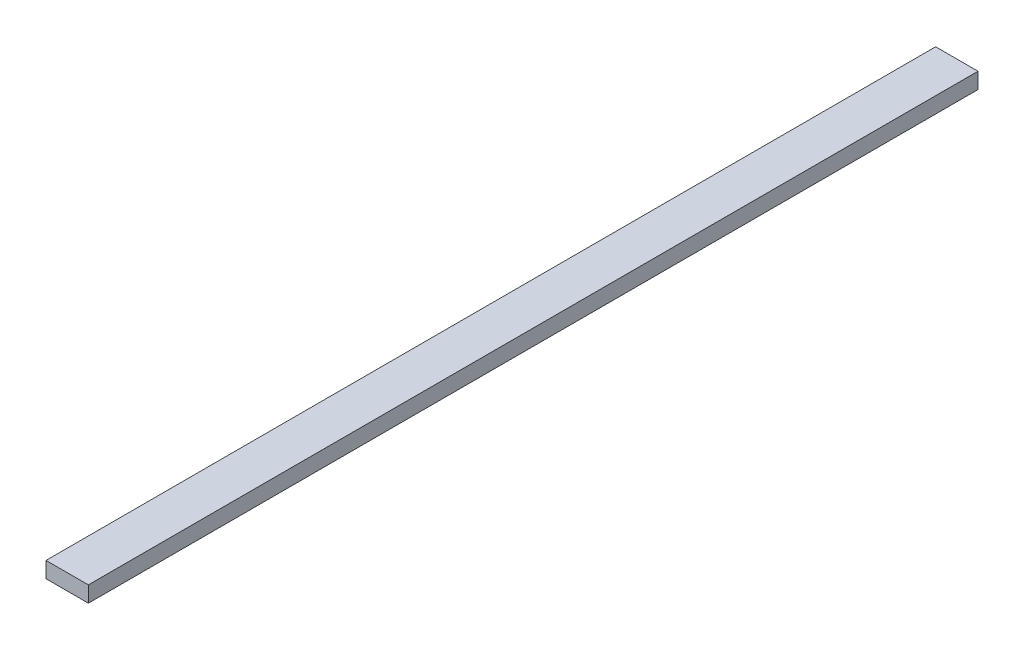
ISO-10303-21;
HEADER;
FILE_DESCRIPTION(('STEP AP214'),'2;1');
FILE_NAME('part.step','',(''),(''),'','','');
FILE_SCHEMA(('AUTOMOTIVE_DESIGN { 1 0 10303 214 1 1 1 1 }'));
ENDSEC;
DATA;
#1=APPLICATION_CONTEXT('core data for automotive mechanical design processes');
#2=APPLICATION_PROTOCOL_DEFINITION('international standard','automotive_design',2000,#1);
#3=PRODUCT_CONTEXT('',#1,'mechanical');
#4=PRODUCT('Part','Part','',(#3));
#5=PRODUCT_RELATED_PRODUCT_CATEGORY('part','',(#4));
#6=PRODUCT_DEFINITION_FORMATION('','',#4);
#7=PRODUCT_DEFINITION_CONTEXT('part definition',#1,'design');
#8=PRODUCT_DEFINITION('design','',#6,#7);
#9=PRODUCT_DEFINITION_SHAPE('','',#8);
#10=(LENGTH_UNIT() NAMED_UNIT(*) SI_UNIT(.MILLI.,.METRE.));
#11=(NAMED_UNIT(*) PLANE_ANGLE_UNIT() SI_UNIT($,.RADIAN.));
#12=(NAMED_UNIT(*) SI_UNIT($,.STERADIAN.) SOLID_ANGLE_UNIT());
#13=UNCERTAINTY_MEASURE_WITH_UNIT(LENGTH_MEASURE(1.E-05),#10,'distance_accuracy_value','');
#14=(GEOMETRIC_REPRESENTATION_CONTEXT(3) GLOBAL_UNCERTAINTY_ASSIGNED_CONTEXT((#13)) GLOBAL_UNIT_ASSIGNED_CONTEXT((#10,
#11,#12)) REPRESENTATION_CONTEXT('',''));
#15=CARTESIAN_POINT('',(0.,0.,0.));
#16=DIRECTION('',(0.,0.,1.));
#17=DIRECTION('',(1.,0.,0.));
#18=AXIS2_PLACEMENT_3D('',#15,#16,#17);
#19=CARTESIAN_POINT('',(25.4,19.05,533.4));
#20=DIRECTION('',(-1.,0.,0.));
#21=DIRECTION('',(0.,0.,1.));
#22=AXIS2_PLACEMENT_3D('',#19,#20,#21);
#23=PLANE('',#22);
#24=DIRECTION('',(0.,0.,-1.));
#25=VECTOR('',#24,1.);
#26=CARTESIAN_POINT('',(25.4,0.,533.4));
#27=LINE('',#26,#25);
#28=CARTESIAN_POINT('',(25.4,0.,533.4));
#29=VERTEX_POINT('',#28);
#30=CARTESIAN_POINT('',(25.4,0.,-533.4));
#31=VERTEX_POINT('',#30);
#32=EDGE_CURVE('E107',#29,#31,#27,.T.);
#33=ORIENTED_EDGE('',*,*,#32,.T.);
#34=DIRECTION('',(0.,-1.,0.));
#35=VECTOR('',#34,1.);
#36=CARTESIAN_POINT('',(25.4,19.05,-533.4));
#37=LINE('',#36,#35);
#38=CARTESIAN_POINT('',(25.4,19.05,-533.4));
#39=VERTEX_POINT('',#38);
#40=EDGE_CURVE('E11',#39,#31,#37,.T.);
#41=ORIENTED_EDGE('',*,*,#40,.F.);
#42=DIRECTION('',(0.,0.,-1.));
#43=VECTOR('',#42,1.);
#44=CARTESIAN_POINT('',(25.4,19.05,533.4));
#45=LINE('',#44,#43);
#46=CARTESIAN_POINT('',(25.4,19.05,533.4));
#47=VERTEX_POINT('',#46);
#48=EDGE_CURVE('E91',#47,#39,#45,.T.);
#49=ORIENTED_EDGE('',*,*,#48,.F.);
#50=DIRECTION('',(0.,-1.,0.));
#51=VECTOR('',#50,1.);
#52=CARTESIAN_POINT('',(25.4,19.05,533.4));
#53=LINE('',#52,#51);
#54=EDGE_CURVE('E103',#47,#29,#53,.T.);
#55=ORIENTED_EDGE('',*,*,#54,.T.);
#56=EDGE_LOOP('',(#33,#41,#49,#55));
#57=FACE_BOUND('',#56,.T.);
#58=ADVANCED_FACE('F39',(#57),#23,.F.);
#59=CARTESIAN_POINT('',(-25.4,19.05,-533.4));
#60=DIRECTION('',(0.,0.,1.));
#61=DIRECTION('',(1.,0.,0.));
#62=AXIS2_PLACEMENT_3D('',#59,#60,#61);
#63=PLANE('',#62);
#64=DIRECTION('',(-1.,0.,0.));
#65=VECTOR('',#64,1.);
#66=CARTESIAN_POINT('',(-25.4,0.,-533.4));
#67=LINE('',#66,#65);
#68=CARTESIAN_POINT('',(-25.4,0.,-533.4));
#69=VERTEX_POINT('',#68);
#70=EDGE_CURVE('E96',#31,#69,#67,.T.);
#71=ORIENTED_EDGE('',*,*,#70,.T.);
#72=DIRECTION('',(0.,-1.,0.));
#73=VECTOR('',#72,1.);
#74=CARTESIAN_POINT('',(-25.4,19.05,-533.4));
#75=LINE('',#74,#73);
#76=CARTESIAN_POINT('',(-25.4,19.05,-533.4));
#77=VERTEX_POINT('',#76);
#78=EDGE_CURVE('E48',#77,#69,#75,.T.);
#79=ORIENTED_EDGE('',*,*,#78,.F.);
#80=DIRECTION('',(-1.,0.,0.));
#81=VECTOR('',#80,1.);
#82=CARTESIAN_POINT('',(-25.4,19.05,-533.4));
#83=LINE('',#82,#81);
#84=EDGE_CURVE('E86',#39,#77,#83,.T.);
#85=ORIENTED_EDGE('',*,*,#84,.F.);
#86=ORIENTED_EDGE('',*,*,#40,.T.);
#87=EDGE_LOOP('',(#71,#79,#85,#86));
#88=FACE_BOUND('',#87,.T.);
#89=ADVANCED_FACE('F95',(#88),#63,.F.);
#90=CARTESIAN_POINT('',(-25.4,19.05,533.4));
#91=DIRECTION('',(1.,0.,0.));
#92=DIRECTION('',(0.,0.,-1.));
#93=AXIS2_PLACEMENT_3D('',#90,#91,#92);
#94=PLANE('',#93);
#95=DIRECTION('',(0.,0.,1.));
#96=VECTOR('',#95,1.);
#97=CARTESIAN_POINT('',(-25.4,0.,533.4));
#98=LINE('',#97,#96);
#99=CARTESIAN_POINT('',(-25.4,0.,533.4));
#100=VERTEX_POINT('',#99);
#101=EDGE_CURVE('E73',#69,#100,#98,.T.);
#102=ORIENTED_EDGE('',*,*,#101,.T.);
#103=DIRECTION('',(0.,-1.,0.));
#104=VECTOR('',#103,1.);
#105=CARTESIAN_POINT('',(-25.4,19.05,533.4));
#106=LINE('',#105,#104);
#107=CARTESIAN_POINT('',(-25.4,19.05,533.4));
#108=VERTEX_POINT('',#107);
#109=EDGE_CURVE('E98',#108,#100,#106,.T.);
#110=ORIENTED_EDGE('',*,*,#109,.F.);
#111=DIRECTION('',(0.,0.,1.));
#112=VECTOR('',#111,1.);
#113=CARTESIAN_POINT('',(-25.4,19.05,533.4));
#114=LINE('',#113,#112);
#115=EDGE_CURVE('E89',#77,#108,#114,.T.);
#116=ORIENTED_EDGE('',*,*,#115,.F.);
#117=ORIENTED_EDGE('',*,*,#78,.T.);
#118=EDGE_LOOP('',(#102,#110,#116,#117));
#119=FACE_BOUND('',#118,.T.);
#120=ADVANCED_FACE('F99',(#119),#94,.F.);
#121=CARTESIAN_POINT('',(-25.4,19.05,533.4));
#122=DIRECTION('',(0.,0.,-1.));
#123=DIRECTION('',(-1.,0.,0.));
#124=AXIS2_PLACEMENT_3D('',#121,#122,#123);
#125=PLANE('',#124);
#126=DIRECTION('',(1.,0.,0.));
#127=VECTOR('',#126,1.);
#128=CARTESIAN_POINT('',(-25.4,0.,533.4));
#129=LINE('',#128,#127);
#130=EDGE_CURVE('E79',#100,#29,#129,.T.);
#131=ORIENTED_EDGE('',*,*,#130,.T.);
#132=ORIENTED_EDGE('',*,*,#54,.F.);
#133=DIRECTION('',(1.,0.,0.));
#134=VECTOR('',#133,1.);
#135=CARTESIAN_POINT('',(-25.4,19.05,533.4));
#136=LINE('',#135,#134);
#137=EDGE_CURVE('E56',#108,#47,#136,.T.);
#138=ORIENTED_EDGE('',*,*,#137,.F.);
#139=ORIENTED_EDGE('',*,*,#109,.T.);
#140=EDGE_LOOP('',(#131,#132,#138,#139));
#141=FACE_BOUND('',#140,.T.);
#142=ADVANCED_FACE('F120',(#141),#125,.F.);
#143=CARTESIAN_POINT('',(0.,19.05,0.));
#144=DIRECTION('',(0.,-1.,0.));
#145=DIRECTION('',(0.,0.,-1.));
#146=AXIS2_PLACEMENT_3D('',#143,#144,#145);
#147=PLANE('',#146);
#148=ORIENTED_EDGE('',*,*,#48,.T.);
#149=ORIENTED_EDGE('',*,*,#84,.T.);
#150=ORIENTED_EDGE('',*,*,#115,.T.);
#151=ORIENTED_EDGE('',*,*,#137,.T.);
#152=EDGE_LOOP('',(#148,#149,#150,#151));
#153=FACE_BOUND('',#152,.T.);
#154=ADVANCED_FACE('F87',(#153),#147,.F.);
#155=CARTESIAN_POINT('',(0.,0.,0.));
#156=DIRECTION('',(0.,-1.,0.));
#157=DIRECTION('',(0.,0.,-1.));
#158=AXIS2_PLACEMENT_3D('',#155,#156,#157);
#159=PLANE('',#158);
#160=ORIENTED_EDGE('',*,*,#32,.F.);
#161=ORIENTED_EDGE('',*,*,#130,.F.);
#162=ORIENTED_EDGE('',*,*,#101,.F.);
#163=ORIENTED_EDGE('',*,*,#70,.F.);
#164=EDGE_LOOP('',(#160,#161,#162,#163));
#165=FACE_BOUND('',#164,.T.);
#166=ADVANCED_FACE('F123',(#165),#159,.T.);
#167=CLOSED_SHELL('',(#58,#89,#120,#142,#154,#166));
#168=MANIFOLD_SOLID_BREP('B2',#167);
#169=ADVANCED_BREP_SHAPE_REPRESENTATION('',(#18,#168),#14);
#170=SHAPE_DEFINITION_REPRESENTATION(#9,#169);
ENDSEC;
END-ISO-10303-21;
